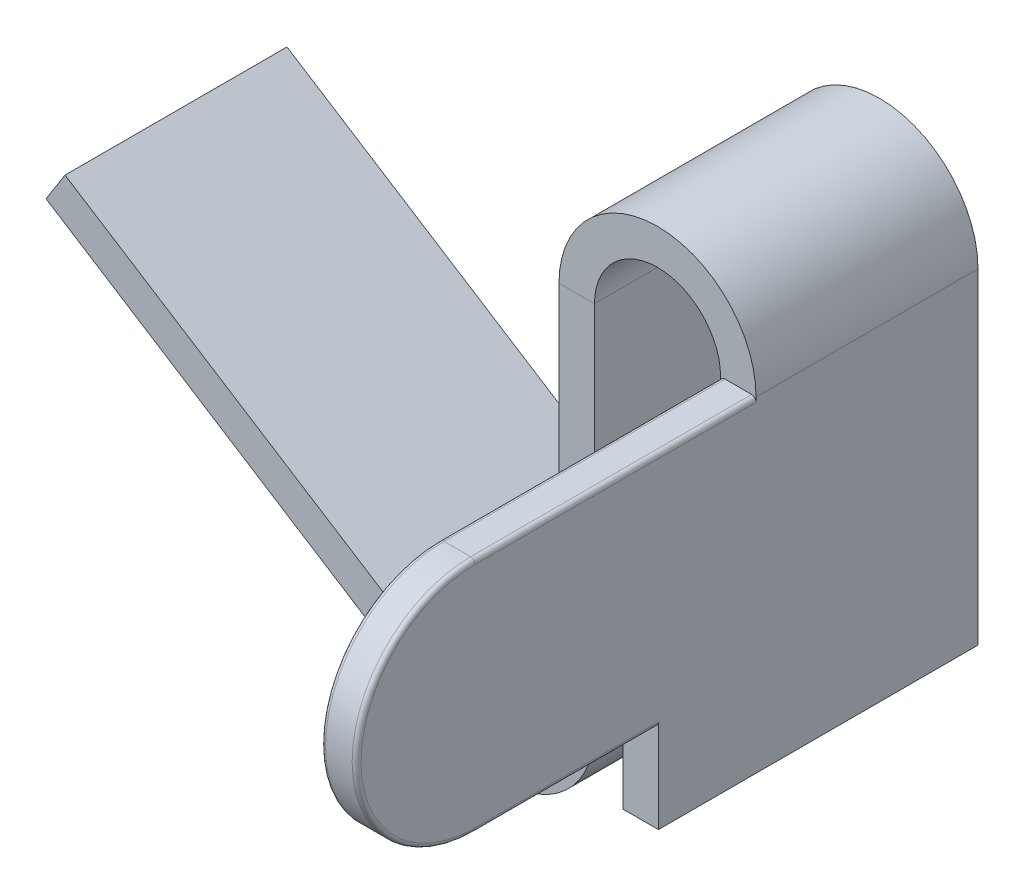
ISO-10303-21;
HEADER;
FILE_DESCRIPTION(('STEP AP214'),'2;1');
FILE_NAME('part.step','',(''),(''),'','','');
FILE_SCHEMA(('AUTOMOTIVE_DESIGN { 1 0 10303 214 1 1 1 1 }'));
ENDSEC;
DATA;
#1=APPLICATION_CONTEXT('core data for automotive mechanical design processes');
#2=APPLICATION_PROTOCOL_DEFINITION('international standard','automotive_design',2000,#1);
#3=PRODUCT_CONTEXT('',#1,'mechanical');
#4=PRODUCT('Part','Part','',(#3));
#5=PRODUCT_RELATED_PRODUCT_CATEGORY('part','',(#4));
#6=PRODUCT_DEFINITION_FORMATION('','',#4);
#7=PRODUCT_DEFINITION_CONTEXT('part definition',#1,'design');
#8=PRODUCT_DEFINITION('design','',#6,#7);
#9=PRODUCT_DEFINITION_SHAPE('','',#8);
#10=(LENGTH_UNIT() NAMED_UNIT(*) SI_UNIT(.MILLI.,.METRE.));
#11=(NAMED_UNIT(*) PLANE_ANGLE_UNIT() SI_UNIT($,.RADIAN.));
#12=(NAMED_UNIT(*) SI_UNIT($,.STERADIAN.) SOLID_ANGLE_UNIT());
#13=UNCERTAINTY_MEASURE_WITH_UNIT(LENGTH_MEASURE(1.E-05),#10,'distance_accuracy_value','');
#14=(GEOMETRIC_REPRESENTATION_CONTEXT(3) GLOBAL_UNCERTAINTY_ASSIGNED_CONTEXT((#13)) GLOBAL_UNIT_ASSIGNED_CONTEXT((#10,
#11,#12)) REPRESENTATION_CONTEXT('',''));
#15=CARTESIAN_POINT('',(0.,0.,0.));
#16=DIRECTION('',(0.,0.,1.));
#17=DIRECTION('',(1.,0.,0.));
#18=AXIS2_PLACEMENT_3D('',#15,#16,#17);
#19=CARTESIAN_POINT('',(0.71,0.5,5.665));
#20=DIRECTION('',(-1.,0.,0.));
#21=DIRECTION('',(0.,-1.,0.));
#22=AXIS2_PLACEMENT_3D('',#19,#20,#21);
#23=CYLINDRICAL_SURFACE('',#22,1.335);
#24=DIRECTION('',(1.,0.,0.));
#25=VECTOR('',#24,1.);
#26=CARTESIAN_POINT('',(0.71,-0.835,5.665));
#27=LINE('',#26,#25);
#28=CARTESIAN_POINT('',(1.06,-0.835,5.665));
#29=VERTEX_POINT('',#28);
#30=CARTESIAN_POINT('',(0.76,-0.835,5.665));
#31=VERTEX_POINT('',#30);
#32=EDGE_CURVE('E244',#29,#31,#27,.F.);
#33=ORIENTED_EDGE('',*,*,#32,.F.);
#34=CARTESIAN_POINT('',(1.06,0.5,5.665));
#35=DIRECTION('',(-1.,0.,0.));
#36=DIRECTION('',(0.,-1.,0.));
#37=AXIS2_PLACEMENT_3D('',#34,#35,#36);
#38=CIRCLE('',#37,1.335);
#39=CARTESIAN_POINT('',(1.06,1.835,5.665));
#40=VERTEX_POINT('',#39);
#41=EDGE_CURVE('E274',#29,#40,#38,.T.);
#42=ORIENTED_EDGE('',*,*,#41,.T.);
#43=DIRECTION('',(1.,0.,0.));
#44=VECTOR('',#43,1.);
#45=CARTESIAN_POINT('',(0.709999999999999,1.835,5.665));
#46=LINE('',#45,#44);
#47=CARTESIAN_POINT('',(0.76,1.835,5.665));
#48=VERTEX_POINT('',#47);
#49=EDGE_CURVE('E241',#48,#40,#46,.T.);
#50=ORIENTED_EDGE('',*,*,#49,.F.);
#51=CARTESIAN_POINT('',(0.76,0.5,5.665));
#52=DIRECTION('',(-1.,0.,0.));
#53=DIRECTION('',(0.,-1.,0.));
#54=AXIS2_PLACEMENT_3D('',#51,#52,#53);
#55=CIRCLE('',#54,1.335);
#56=EDGE_CURVE('E272',#48,#31,#55,.F.);
#57=ORIENTED_EDGE('',*,*,#56,.T.);
#58=EDGE_LOOP('',(#33,#42,#50,#57));
#59=FACE_BOUND('',#58,.T.);
#60=ADVANCED_FACE('F38',(#59),#23,.T.);
#61=CARTESIAN_POINT('',(-0.710000000000001,1.835,2.5));
#62=DIRECTION('',(0.,0.,1.));
#63=DIRECTION('',(1.,0.,0.));
#64=AXIS2_PLACEMENT_3D('',#61,#62,#63);
#65=PLANE('',#64);
#66=DIRECTION('',(-1.,0.,0.));
#67=VECTOR('',#66,1.);
#68=CARTESIAN_POINT('',(-0.710000000000001,1.835,2.5));
#69=LINE('',#68,#67);
#70=CARTESIAN_POINT('',(-0.710000000000001,1.835,2.5));
#71=VERTEX_POINT('',#70);
#72=CARTESIAN_POINT('',(-1.11,1.835,2.5));
#73=VERTEX_POINT('',#72);
#74=EDGE_CURVE('E239',#71,#73,#69,.T.);
#75=ORIENTED_EDGE('',*,*,#74,.F.);
#76=CARTESIAN_POINT('',(0.,1.835,2.5));
#77=DIRECTION('',(0.,0.,1.));
#78=DIRECTION('',(1.,0.,0.));
#79=AXIS2_PLACEMENT_3D('',#76,#77,#78);
#80=CIRCLE('',#79,0.710000000000001);
#81=CARTESIAN_POINT('',(0.71,1.835,2.5));
#82=VERTEX_POINT('',#81);
#83=EDGE_CURVE('E329',#82,#71,#80,.T.);
#84=ORIENTED_EDGE('',*,*,#83,.F.);
#85=DIRECTION('',(0.,1.,0.));
#86=VECTOR('',#85,1.);
#87=CARTESIAN_POINT('',(0.710000000000001,-1.835,2.5));
#88=LINE('',#87,#86);
#89=CARTESIAN_POINT('',(0.71,1.785,2.5));
#90=VERTEX_POINT('',#89);
#91=EDGE_CURVE('E270',#90,#82,#88,.T.);
#92=ORIENTED_EDGE('',*,*,#91,.F.);
#93=CARTESIAN_POINT('',(0.76,1.785,2.5));
#94=DIRECTION('',(0.,0.,1.));
#95=DIRECTION('',(1.,0.,0.));
#96=AXIS2_PLACEMENT_3D('',#93,#94,#95);
#97=CIRCLE('',#96,0.05);
#98=CARTESIAN_POINT('',(0.76,1.835,2.5));
#99=VERTEX_POINT('',#98);
#100=EDGE_CURVE('E11',#90,#99,#97,.F.);
#101=ORIENTED_EDGE('',*,*,#100,.T.);
#102=DIRECTION('',(-1.,0.,0.));
#103=VECTOR('',#102,1.);
#104=CARTESIAN_POINT('',(1.11,1.835,2.5));
#105=LINE('',#104,#103);
#106=CARTESIAN_POINT('',(1.06,1.835,2.5));
#107=VERTEX_POINT('',#106);
#108=EDGE_CURVE('E236',#107,#99,#105,.T.);
#109=ORIENTED_EDGE('',*,*,#108,.F.);
#110=CARTESIAN_POINT('',(1.06,1.785,2.5));
#111=DIRECTION('',(0.,0.,1.));
#112=DIRECTION('',(1.,0.,0.));
#113=AXIS2_PLACEMENT_3D('',#110,#111,#112);
#114=CIRCLE('',#113,0.05);
#115=CARTESIAN_POINT('',(1.11,1.785,2.5));
#116=VERTEX_POINT('',#115);
#117=EDGE_CURVE('E276',#107,#116,#114,.F.);
#118=ORIENTED_EDGE('',*,*,#117,.T.);
#119=DIRECTION('',(0.,-1.,0.));
#120=VECTOR('',#119,1.);
#121=CARTESIAN_POINT('',(1.11,1.835,2.5));
#122=LINE('',#121,#120);
#123=CARTESIAN_POINT('',(1.11,1.835,2.5));
#124=VERTEX_POINT('',#123);
#125=EDGE_CURVE('E55',#124,#116,#122,.T.);
#126=ORIENTED_EDGE('',*,*,#125,.F.);
#127=CARTESIAN_POINT('',(0.,1.835,2.5));
#128=DIRECTION('',(0.,0.,1.));
#129=DIRECTION('',(1.,0.,0.));
#130=AXIS2_PLACEMENT_3D('',#127,#128,#129);
#131=CIRCLE('',#130,1.11);
#132=EDGE_CURVE('E332',#124,#73,#131,.T.);
#133=ORIENTED_EDGE('',*,*,#132,.T.);
#134=EDGE_LOOP('',(#75,#84,#92,#101,#109,#118,#126,#133));
#135=FACE_BOUND('',#134,.T.);
#136=ADVANCED_FACE('F432',(#135),#65,.T.);
#137=CARTESIAN_POINT('',(1.11,1.835,2.5));
#138=DIRECTION('',(0.,0.,1.));
#139=DIRECTION('',(1.,0.,0.));
#140=AXIS2_PLACEMENT_3D('',#137,#138,#139);
#141=PLANE('',#140);
#142=DIRECTION('',(0.,-1.,0.));
#143=VECTOR('',#142,1.);
#144=CARTESIAN_POINT('',(-0.710000000000001,-1.835,2.5));
#145=LINE('',#144,#143);
#146=CARTESIAN_POINT('',(-0.71,-2.335,2.5));
#147=VERTEX_POINT('',#146);
#148=EDGE_CURVE('E326',#71,#147,#145,.T.);
#149=ORIENTED_EDGE('',*,*,#148,.F.);
#150=ORIENTED_EDGE('',*,*,#74,.T.);
#151=DIRECTION('',(0.,-1.,0.));
#152=VECTOR('',#151,1.);
#153=CARTESIAN_POINT('',(-1.11,1.835,2.5));
#154=LINE('',#153,#152);
#155=CARTESIAN_POINT('',(-1.11,-2.335,2.5));
#156=VERTEX_POINT('',#155);
#157=EDGE_CURVE('E334',#73,#156,#154,.T.);
#158=ORIENTED_EDGE('',*,*,#157,.T.);
#159=DIRECTION('',(1.,0.,0.));
#160=VECTOR('',#159,1.);
#161=CARTESIAN_POINT('',(-1.11,-2.335,2.5));
#162=LINE('',#161,#160);
#163=EDGE_CURVE('E228',#156,#147,#162,.T.);
#164=ORIENTED_EDGE('',*,*,#163,.T.);
#165=EDGE_LOOP('',(#149,#150,#158,#164));
#166=FACE_BOUND('',#165,.T.);
#167=ADVANCED_FACE('F430',(#166),#141,.T.);
#168=CARTESIAN_POINT('',(0.71,1.835,0.));
#169=DIRECTION('',(0.,0.,-1.));
#170=DIRECTION('',(-1.,0.,0.));
#171=AXIS2_PLACEMENT_3D('',#168,#169,#170);
#172=PLANE('',#171);
#173=DIRECTION('',(1.,0.,0.));
#174=VECTOR('',#173,1.);
#175=CARTESIAN_POINT('',(0.71,1.835,0.));
#176=LINE('',#175,#174);
#177=CARTESIAN_POINT('',(0.71,1.835,0.));
#178=VERTEX_POINT('',#177);
#179=CARTESIAN_POINT('',(1.11,1.835,0.));
#180=VERTEX_POINT('',#179);
#181=EDGE_CURVE('E234',#178,#180,#176,.T.);
#182=ORIENTED_EDGE('',*,*,#181,.F.);
#183=CARTESIAN_POINT('',(0.,1.835,0.));
#184=DIRECTION('',(0.,0.,1.));
#185=DIRECTION('',(1.,0.,0.));
#186=AXIS2_PLACEMENT_3D('',#183,#184,#185);
#187=CIRCLE('',#186,0.710000000000001);
#188=CARTESIAN_POINT('',(-0.710000000000001,1.835,0.));
#189=VERTEX_POINT('',#188);
#190=EDGE_CURVE('E355',#178,#189,#187,.T.);
#191=ORIENTED_EDGE('',*,*,#190,.T.);
#192=DIRECTION('',(1.,0.,0.));
#193=VECTOR('',#192,1.);
#194=CARTESIAN_POINT('',(-1.11,1.835,0.));
#195=LINE('',#194,#193);
#196=CARTESIAN_POINT('',(-1.11,1.835,0.));
#197=VERTEX_POINT('',#196);
#198=EDGE_CURVE('E232',#197,#189,#195,.T.);
#199=ORIENTED_EDGE('',*,*,#198,.F.);
#200=CARTESIAN_POINT('',(0.,1.835,0.));
#201=DIRECTION('',(0.,0.,1.));
#202=DIRECTION('',(1.,0.,0.));
#203=AXIS2_PLACEMENT_3D('',#200,#201,#202);
#204=CIRCLE('',#203,1.11);
#205=EDGE_CURVE('E364',#180,#197,#204,.T.);
#206=ORIENTED_EDGE('',*,*,#205,.F.);
#207=EDGE_LOOP('',(#182,#191,#199,#206));
#208=FACE_BOUND('',#207,.T.);
#209=ADVANCED_FACE('F388',(#208),#172,.T.);
#210=CARTESIAN_POINT('',(-1.11,1.835,0.));
#211=DIRECTION('',(0.,0.,-1.));
#212=DIRECTION('',(-1.,0.,0.));
#213=AXIS2_PLACEMENT_3D('',#210,#211,#212);
#214=PLANE('',#213);
#215=DIRECTION('',(0.,1.,0.));
#216=VECTOR('',#215,1.);
#217=CARTESIAN_POINT('',(0.710000000000001,-1.835,0.));
#218=LINE('',#217,#216);
#219=CARTESIAN_POINT('',(0.710000000000001,-1.835,0.));
#220=VERTEX_POINT('',#219);
#221=EDGE_CURVE('E358',#220,#178,#218,.T.);
#222=ORIENTED_EDGE('',*,*,#221,.T.);
#223=ORIENTED_EDGE('',*,*,#181,.T.);
#224=DIRECTION('',(0.,1.,0.));
#225=VECTOR('',#224,1.);
#226=CARTESIAN_POINT('',(1.11,-1.835,0.));
#227=LINE('',#226,#225);
#228=CARTESIAN_POINT('',(1.11,-1.835,0.));
#229=VERTEX_POINT('',#228);
#230=EDGE_CURVE('E362',#229,#180,#227,.T.);
#231=ORIENTED_EDGE('',*,*,#230,.F.);
#232=DIRECTION('',(-1.,0.,0.));
#233=VECTOR('',#232,1.);
#234=CARTESIAN_POINT('',(1.11,-1.835,0.));
#235=LINE('',#234,#233);
#236=EDGE_CURVE('E198',#229,#220,#235,.T.);
#237=ORIENTED_EDGE('',*,*,#236,.T.);
#238=EDGE_LOOP('',(#222,#223,#231,#237));
#239=FACE_BOUND('',#238,.T.);
#240=ADVANCED_FACE('F617',(#239),#214,.T.);
#241=CARTESIAN_POINT('',(-2.24626881057682,-3.1790472515224,2.5));
#242=DIRECTION('',(0.,0.,1.));
#243=DIRECTION('',(1.,0.,0.));
#244=AXIS2_PLACEMENT_3D('',#241,#242,#243);
#245=PLANE('',#244);
#246=DIRECTION('',(0.536268810576819,0.844047251522404,0.));
#247=VECTOR('',#246,1.);
#248=CARTESIAN_POINT('',(-2.24626881057682,-3.1790472515224,2.5));
#249=LINE('',#248,#247);
#250=CARTESIAN_POINT('',(-2.24626881057682,-3.1790472515224,2.5));
#251=VERTEX_POINT('',#250);
#252=CARTESIAN_POINT('',(-2.03176128634609,-2.84142835091344,2.5));
#253=VERTEX_POINT('',#252);
#254=EDGE_CURVE('E230',#251,#253,#249,.T.);
#255=ORIENTED_EDGE('',*,*,#254,.F.);
#256=CARTESIAN_POINT('',(-1.71,-2.335,2.5));
#257=DIRECTION('',(0.,0.,-1.));
#258=DIRECTION('',(-1.,0.,0.));
#259=AXIS2_PLACEMENT_3D('',#256,#257,#258);
#260=CIRCLE('',#259,1.);
#261=EDGE_CURVE('E323',#147,#251,#260,.T.);
#262=ORIENTED_EDGE('',*,*,#261,.F.);
#263=ORIENTED_EDGE('',*,*,#163,.F.);
#264=CARTESIAN_POINT('',(-1.71,-2.335,2.5));
#265=DIRECTION('',(0.,0.,1.));
#266=DIRECTION('',(1.,0.,0.));
#267=AXIS2_PLACEMENT_3D('',#264,#265,#266);
#268=CIRCLE('',#267,0.6);
#269=EDGE_CURVE('E337',#156,#253,#268,.F.);
#270=ORIENTED_EDGE('',*,*,#269,.T.);
#271=EDGE_LOOP('',(#255,#262,#263,#270));
#272=FACE_BOUND('',#271,.T.);
#273=ADVANCED_FACE('F424',(#272),#245,.T.);
#274=CARTESIAN_POINT('',(-1.11,-2.335,2.5));
#275=DIRECTION('',(0.,0.,1.));
#276=DIRECTION('',(1.,0.,0.));
#277=AXIS2_PLACEMENT_3D('',#274,#275,#276);
#278=PLANE('',#277);
#279=DIRECTION('',(-0.844047251522404,0.536268810576819,0.));
#280=VECTOR('',#279,1.);
#281=CARTESIAN_POINT('',(-2.24626881057682,-3.1790472515224,2.5));
#282=LINE('',#281,#280);
#283=CARTESIAN_POINT('',(-6.88852869395004,-0.229568793349898,2.5));
#284=VERTEX_POINT('',#283);
#285=EDGE_CURVE('E320',#251,#284,#282,.T.);
#286=ORIENTED_EDGE('',*,*,#285,.F.);
#287=ORIENTED_EDGE('',*,*,#254,.T.);
#288=DIRECTION('',(-0.844047251522404,0.536268810576819,0.));
#289=VECTOR('',#288,1.);
#290=CARTESIAN_POINT('',(-2.03176128634609,-2.84142835091344,2.5));
#291=LINE('',#290,#289);
#292=CARTESIAN_POINT('',(-6.67402116971931,0.108050107259063,2.5));
#293=VERTEX_POINT('',#292);
#294=EDGE_CURVE('E314',#253,#293,#291,.T.);
#295=ORIENTED_EDGE('',*,*,#294,.T.);
#296=DIRECTION('',(0.536268810576815,0.844047251522406,0.));
#297=VECTOR('',#296,1.);
#298=CARTESIAN_POINT('',(-6.88852869395004,-0.229568793349898,2.5));
#299=LINE('',#298,#297);
#300=EDGE_CURVE('E316',#284,#293,#299,.T.);
#301=ORIENTED_EDGE('',*,*,#300,.F.);
#302=EDGE_LOOP('',(#286,#287,#295,#301));
#303=FACE_BOUND('',#302,.T.);
#304=ADVANCED_FACE('F415',(#303),#278,.T.);
#305=CARTESIAN_POINT('',(-0.71,-2.335,0.));
#306=DIRECTION('',(0.,0.,-1.));
#307=DIRECTION('',(-1.,0.,0.));
#308=AXIS2_PLACEMENT_3D('',#305,#306,#307);
#309=PLANE('',#308);
#310=DIRECTION('',(-1.,0.,0.));
#311=VECTOR('',#310,1.);
#312=CARTESIAN_POINT('',(-0.71,-2.335,0.));
#313=LINE('',#312,#311);
#314=CARTESIAN_POINT('',(-0.71,-2.335,0.));
#315=VERTEX_POINT('',#314);
#316=CARTESIAN_POINT('',(-1.11,-2.335,0.));
#317=VERTEX_POINT('',#316);
#318=EDGE_CURVE('E226',#315,#317,#313,.T.);
#319=ORIENTED_EDGE('',*,*,#318,.F.);
#320=CARTESIAN_POINT('',(-1.71,-2.335,0.));
#321=DIRECTION('',(0.,0.,-1.));
#322=DIRECTION('',(-1.,0.,0.));
#323=AXIS2_PLACEMENT_3D('',#320,#321,#322);
#324=CIRCLE('',#323,1.);
#325=CARTESIAN_POINT('',(-2.24626881057682,-3.1790472515224,0.));
#326=VERTEX_POINT('',#325);
#327=EDGE_CURVE('E349',#315,#326,#324,.T.);
#328=ORIENTED_EDGE('',*,*,#327,.T.);
#329=DIRECTION('',(-0.536268810576819,-0.844047251522404,0.));
#330=VECTOR('',#329,1.);
#331=CARTESIAN_POINT('',(-2.03176128634609,-2.84142835091344,0.));
#332=LINE('',#331,#330);
#333=CARTESIAN_POINT('',(-2.03176128634609,-2.84142835091344,0.));
#334=VERTEX_POINT('',#333);
#335=EDGE_CURVE('E224',#334,#326,#332,.T.);
#336=ORIENTED_EDGE('',*,*,#335,.F.);
#337=CARTESIAN_POINT('',(-1.71,-2.335,0.));
#338=DIRECTION('',(0.,0.,1.));
#339=DIRECTION('',(1.,0.,0.));
#340=AXIS2_PLACEMENT_3D('',#337,#338,#339);
#341=CIRCLE('',#340,0.6);
#342=EDGE_CURVE('E317',#317,#334,#341,.F.);
#343=ORIENTED_EDGE('',*,*,#342,.F.);
#344=EDGE_LOOP('',(#319,#328,#336,#343));
#345=FACE_BOUND('',#344,.T.);
#346=ADVANCED_FACE('F395',(#345),#309,.T.);
#347=CARTESIAN_POINT('',(-2.03176128634609,-2.84142835091344,0.));
#348=DIRECTION('',(0.,0.,-1.));
#349=DIRECTION('',(-1.,0.,0.));
#350=AXIS2_PLACEMENT_3D('',#347,#348,#349);
#351=PLANE('',#350);
#352=DIRECTION('',(0.,-1.,0.));
#353=VECTOR('',#352,1.);
#354=CARTESIAN_POINT('',(-0.710000000000001,1.835,0.));
#355=LINE('',#354,#353);
#356=EDGE_CURVE('E352',#189,#315,#355,.T.);
#357=ORIENTED_EDGE('',*,*,#356,.T.);
#358=ORIENTED_EDGE('',*,*,#318,.T.);
#359=DIRECTION('',(0.,-1.,0.));
#360=VECTOR('',#359,1.);
#361=CARTESIAN_POINT('',(-1.11,-1.835,0.));
#362=LINE('',#361,#360);
#363=EDGE_CURVE('E367',#197,#317,#362,.T.);
#364=ORIENTED_EDGE('',*,*,#363,.F.);
#365=ORIENTED_EDGE('',*,*,#198,.T.);
#366=EDGE_LOOP('',(#357,#358,#364,#365));
#367=FACE_BOUND('',#366,.T.);
#368=ADVANCED_FACE('F391',(#367),#351,.T.);
#369=CARTESIAN_POINT('',(-2.03176128634609,-2.84142835091344,2.5));
#370=DIRECTION('',(-0.536268810576819,-0.844047251522404,0.));
#371=DIRECTION('',(0.844047251522404,-0.536268810576819,0.));
#372=AXIS2_PLACEMENT_3D('',#369,#370,#371);
#373=PLANE('',#372);
#374=DIRECTION('',(-0.844047251522404,0.536268810576819,0.));
#375=VECTOR('',#374,1.);
#376=CARTESIAN_POINT('',(-2.03176128634609,-2.84142835091344,0.));
#377=LINE('',#376,#375);
#378=CARTESIAN_POINT('',(-6.67402116971931,0.108050107259063,0.));
#379=VERTEX_POINT('',#378);
#380=EDGE_CURVE('E311',#334,#379,#377,.T.);
#381=ORIENTED_EDGE('',*,*,#380,.T.);
#382=DIRECTION('',(0.,0.,-1.));
#383=VECTOR('',#382,1.);
#384=CARTESIAN_POINT('',(-6.67402116971931,0.108050107259063,2.5));
#385=LINE('',#384,#383);
#386=EDGE_CURVE('E222',#293,#379,#385,.T.);
#387=ORIENTED_EDGE('',*,*,#386,.F.);
#388=ORIENTED_EDGE('',*,*,#294,.F.);
#389=DIRECTION('',(0.,0.,-1.));
#390=VECTOR('',#389,1.);
#391=CARTESIAN_POINT('',(-2.03176128634609,-2.84142835091344,2.5));
#392=LINE('',#391,#390);
#393=EDGE_CURVE('E340',#253,#334,#392,.T.);
#394=ORIENTED_EDGE('',*,*,#393,.T.);
#395=EDGE_LOOP('',(#381,#387,#388,#394));
#396=FACE_BOUND('',#395,.T.);
#397=ADVANCED_FACE('F404',(#396),#373,.F.);
#398=CARTESIAN_POINT('',(-6.88852869395004,-0.229568793349898,2.5));
#399=DIRECTION('',(-0.844047251522406,0.536268810576815,0.));
#400=DIRECTION('',(-0.536268810576815,-0.844047251522406,0.));
#401=AXIS2_PLACEMENT_3D('',#398,#399,#400);
#402=PLANE('',#401);
#403=DIRECTION('',(0.536268810576815,0.844047251522406,0.));
#404=VECTOR('',#403,1.);
#405=CARTESIAN_POINT('',(-6.88852869395004,-0.229568793349898,0.));
#406=LINE('',#405,#404);
#407=CARTESIAN_POINT('',(-6.88852869395004,-0.229568793349898,0.));
#408=VERTEX_POINT('',#407);
#409=EDGE_CURVE('E343',#408,#379,#406,.T.);
#410=ORIENTED_EDGE('',*,*,#409,.F.);
#411=DIRECTION('',(0.,0.,-1.));
#412=VECTOR('',#411,1.);
#413=CARTESIAN_POINT('',(-6.88852869395004,-0.229568793349898,2.5));
#414=LINE('',#413,#412);
#415=EDGE_CURVE('E220',#284,#408,#414,.T.);
#416=ORIENTED_EDGE('',*,*,#415,.F.);
#417=ORIENTED_EDGE('',*,*,#300,.T.);
#418=ORIENTED_EDGE('',*,*,#386,.T.);
#419=EDGE_LOOP('',(#410,#416,#417,#418));
#420=FACE_BOUND('',#419,.T.);
#421=ADVANCED_FACE('F411',(#420),#402,.T.);
#422=CARTESIAN_POINT('',(-2.24626881057682,-3.1790472515224,2.5));
#423=DIRECTION('',(-0.536268810576819,-0.844047251522404,0.));
#424=DIRECTION('',(0.844047251522404,-0.536268810576819,0.));
#425=AXIS2_PLACEMENT_3D('',#422,#423,#424);
#426=PLANE('',#425);
#427=DIRECTION('',(-0.844047251522404,0.536268810576819,0.));
#428=VECTOR('',#427,1.);
#429=CARTESIAN_POINT('',(-2.24626881057682,-3.1790472515224,0.));
#430=LINE('',#429,#428);
#431=EDGE_CURVE('E346',#326,#408,#430,.T.);
#432=ORIENTED_EDGE('',*,*,#431,.F.);
#433=DIRECTION('',(0.,0.,-1.));
#434=VECTOR('',#433,1.);
#435=CARTESIAN_POINT('',(-2.24626881057682,-3.1790472515224,2.5));
#436=LINE('',#435,#434);
#437=EDGE_CURVE('E217',#251,#326,#436,.T.);
#438=ORIENTED_EDGE('',*,*,#437,.F.);
#439=ORIENTED_EDGE('',*,*,#285,.T.);
#440=ORIENTED_EDGE('',*,*,#415,.T.);
#441=EDGE_LOOP('',(#432,#438,#439,#440));
#442=FACE_BOUND('',#441,.T.);
#443=ADVANCED_FACE('F418',(#442),#426,.T.);
#444=CARTESIAN_POINT('',(-1.71,-2.335,2.5));
#445=DIRECTION('',(0.,0.,-1.));
#446=DIRECTION('',(-1.,0.,0.));
#447=AXIS2_PLACEMENT_3D('',#444,#445,#446);
#448=CYLINDRICAL_SURFACE('',#447,1.);
#449=ORIENTED_EDGE('',*,*,#327,.F.);
#450=DIRECTION('',(0.,0.,-1.));
#451=VECTOR('',#450,1.);
#452=CARTESIAN_POINT('',(-0.71,-2.335,2.5));
#453=LINE('',#452,#451);
#454=EDGE_CURVE('E214',#147,#315,#453,.T.);
#455=ORIENTED_EDGE('',*,*,#454,.F.);
#456=ORIENTED_EDGE('',*,*,#261,.T.);
#457=ORIENTED_EDGE('',*,*,#437,.T.);
#458=EDGE_LOOP('',(#449,#455,#456,#457));
#459=FACE_BOUND('',#458,.T.);
#460=ADVANCED_FACE('F420',(#459),#448,.T.);
#461=CARTESIAN_POINT('',(-0.710000000000001,1.835,2.5));
#462=DIRECTION('',(1.,0.,0.));
#463=DIRECTION('',(0.,1.,0.));
#464=AXIS2_PLACEMENT_3D('',#461,#462,#463);
#465=PLANE('',#464);
#466=ORIENTED_EDGE('',*,*,#356,.F.);
#467=DIRECTION('',(0.,0.,-1.));
#468=VECTOR('',#467,1.);
#469=CARTESIAN_POINT('',(-0.710000000000001,1.835,2.5));
#470=LINE('',#469,#468);
#471=EDGE_CURVE('E211',#71,#189,#470,.T.);
#472=ORIENTED_EDGE('',*,*,#471,.F.);
#473=ORIENTED_EDGE('',*,*,#148,.T.);
#474=ORIENTED_EDGE('',*,*,#454,.T.);
#475=EDGE_LOOP('',(#466,#472,#473,#474));
#476=FACE_BOUND('',#475,.T.);
#477=ADVANCED_FACE('F428',(#476),#465,.T.);
#478=CARTESIAN_POINT('',(0.,1.835,2.5));
#479=DIRECTION('',(0.,0.,-1.));
#480=DIRECTION('',(-1.,0.,0.));
#481=AXIS2_PLACEMENT_3D('',#478,#479,#480);
#482=CYLINDRICAL_SURFACE('',#481,0.710000000000001);
#483=ORIENTED_EDGE('',*,*,#190,.F.);
#484=DIRECTION('',(0.,0.,-1.));
#485=VECTOR('',#484,1.);
#486=CARTESIAN_POINT('',(0.71,1.835,2.5));
#487=LINE('',#486,#485);
#488=EDGE_CURVE('E202',#82,#178,#487,.T.);
#489=ORIENTED_EDGE('',*,*,#488,.F.);
#490=ORIENTED_EDGE('',*,*,#83,.T.);
#491=ORIENTED_EDGE('',*,*,#471,.T.);
#492=EDGE_LOOP('',(#483,#489,#490,#491));
#493=FACE_BOUND('',#492,.T.);
#494=ADVANCED_FACE('F555',(#493),#482,.F.);
#495=CARTESIAN_POINT('',(0.710000000000001,-1.835,2.5));
#496=DIRECTION('',(-1.,0.,0.));
#497=DIRECTION('',(0.,-1.,0.));
#498=AXIS2_PLACEMENT_3D('',#495,#496,#497);
#499=PLANE('',#498);
#500=DIRECTION('',(0.,0.,-1.));
#501=VECTOR('',#500,1.);
#502=CARTESIAN_POINT('',(0.71,1.785,2.5));
#503=LINE('',#502,#501);
#504=CARTESIAN_POINT('',(0.71,1.785,5.665));
#505=VERTEX_POINT('',#504);
#506=EDGE_CURVE('E265',#505,#90,#503,.T.);
#507=ORIENTED_EDGE('',*,*,#506,.T.);
#508=ORIENTED_EDGE('',*,*,#91,.T.);
#509=ORIENTED_EDGE('',*,*,#488,.T.);
#510=ORIENTED_EDGE('',*,*,#221,.F.);
#511=DIRECTION('',(0.,0.,-1.));
#512=VECTOR('',#511,1.);
#513=CARTESIAN_POINT('',(0.710000000000001,-1.835,2.5));
#514=LINE('',#513,#512);
#515=CARTESIAN_POINT('',(0.710000000000001,-1.835,3.6));
#516=VERTEX_POINT('',#515);
#517=EDGE_CURVE('E199',#516,#220,#514,.T.);
#518=ORIENTED_EDGE('',*,*,#517,.F.);
#519=DIRECTION('',(0.,-1.,0.));
#520=VECTOR('',#519,1.);
#521=CARTESIAN_POINT('',(0.710000000000001,-1.835,3.6));
#522=LINE('',#521,#520);
#523=CARTESIAN_POINT('',(0.71,-0.785,3.6));
#524=VERTEX_POINT('',#523);
#525=EDGE_CURVE('E63',#524,#516,#522,.T.);
#526=ORIENTED_EDGE('',*,*,#525,.F.);
#527=DIRECTION('',(0.,0.,-1.));
#528=VECTOR('',#527,1.);
#529=CARTESIAN_POINT('',(0.71,-0.785,5.665));
#530=LINE('',#529,#528);
#531=CARTESIAN_POINT('',(0.71,-0.785,5.665));
#532=VERTEX_POINT('',#531);
#533=EDGE_CURVE('E268',#524,#532,#530,.F.);
#534=ORIENTED_EDGE('',*,*,#533,.T.);
#535=CARTESIAN_POINT('',(0.71,0.5,5.665));
#536=DIRECTION('',(-1.,0.,0.));
#537=DIRECTION('',(0.,-1.,0.));
#538=AXIS2_PLACEMENT_3D('',#535,#536,#537);
#539=CIRCLE('',#538,1.285);
#540=EDGE_CURVE('E263',#532,#505,#539,.T.);
#541=ORIENTED_EDGE('',*,*,#540,.T.);
#542=EDGE_LOOP('',(#507,#508,#509,#510,#518,#526,#534,#541));
#543=FACE_BOUND('',#542,.T.);
#544=ADVANCED_FACE('F301',(#543),#499,.T.);
#545=CARTESIAN_POINT('',(1.11,-1.835,2.5));
#546=DIRECTION('',(0.,-1.,0.));
#547=DIRECTION('',(0.,0.,-1.));
#548=AXIS2_PLACEMENT_3D('',#545,#546,#547);
#549=PLANE('',#548);
#550=DIRECTION('',(1.,0.,0.));
#551=VECTOR('',#550,1.);
#552=CARTESIAN_POINT('',(-3.39,-1.835,3.6));
#553=LINE('',#552,#551);
#554=CARTESIAN_POINT('',(1.11,-1.835,3.6));
#555=VERTEX_POINT('',#554);
#556=EDGE_CURVE('E176',#516,#555,#553,.T.);
#557=ORIENTED_EDGE('',*,*,#556,.F.);
#558=ORIENTED_EDGE('',*,*,#517,.T.);
#559=ORIENTED_EDGE('',*,*,#236,.F.);
#560=DIRECTION('',(0.,0.,-1.));
#561=VECTOR('',#560,1.);
#562=CARTESIAN_POINT('',(1.11,-1.835,2.5));
#563=LINE('',#562,#561);
#564=EDGE_CURVE('E188',#555,#229,#563,.T.);
#565=ORIENTED_EDGE('',*,*,#564,.F.);
#566=EDGE_LOOP('',(#557,#558,#559,#565));
#567=FACE_BOUND('',#566,.T.);
#568=ADVANCED_FACE('F196',(#567),#549,.T.);
#569=CARTESIAN_POINT('',(1.11,-1.835,2.5));
#570=DIRECTION('',(-1.,0.,0.));
#571=DIRECTION('',(0.,-1.,0.));
#572=AXIS2_PLACEMENT_3D('',#569,#570,#571);
#573=PLANE('',#572);
#574=DIRECTION('',(0.,0.,1.));
#575=VECTOR('',#574,1.);
#576=CARTESIAN_POINT('',(1.11,-0.785,2.5));
#577=LINE('',#576,#575);
#578=CARTESIAN_POINT('',(1.11,-0.785,5.665));
#579=VERTEX_POINT('',#578);
#580=CARTESIAN_POINT('',(1.11,-0.785,3.6));
#581=VERTEX_POINT('',#580);
#582=EDGE_CURVE('E191',#579,#581,#577,.F.);
#583=ORIENTED_EDGE('',*,*,#582,.T.);
#584=DIRECTION('',(0.,1.,0.));
#585=VECTOR('',#584,1.);
#586=CARTESIAN_POINT('',(1.11,-1.835,3.6));
#587=LINE('',#586,#585);
#588=EDGE_CURVE('E179',#555,#581,#587,.T.);
#589=ORIENTED_EDGE('',*,*,#588,.F.);
#590=ORIENTED_EDGE('',*,*,#564,.T.);
#591=ORIENTED_EDGE('',*,*,#230,.T.);
#592=DIRECTION('',(0.,0.,-1.));
#593=VECTOR('',#592,1.);
#594=CARTESIAN_POINT('',(1.11,1.835,2.5));
#595=LINE('',#594,#593);
#596=EDGE_CURVE('E200',#124,#180,#595,.T.);
#597=ORIENTED_EDGE('',*,*,#596,.F.);
#598=ORIENTED_EDGE('',*,*,#125,.T.);
#599=DIRECTION('',(0.,0.,-1.));
#600=VECTOR('',#599,1.);
#601=CARTESIAN_POINT('',(1.11,1.785,2.5));
#602=LINE('',#601,#600);
#603=CARTESIAN_POINT('',(1.11,1.785,5.665));
#604=VERTEX_POINT('',#603);
#605=EDGE_CURVE('E255',#116,#604,#602,.F.);
#606=ORIENTED_EDGE('',*,*,#605,.T.);
#607=CARTESIAN_POINT('',(1.11,0.5,5.665));
#608=DIRECTION('',(-1.,0.,0.));
#609=DIRECTION('',(0.,-1.,0.));
#610=AXIS2_PLACEMENT_3D('',#607,#608,#609);
#611=CIRCLE('',#610,1.285);
#612=EDGE_CURVE('E252',#604,#579,#611,.F.);
#613=ORIENTED_EDGE('',*,*,#612,.T.);
#614=EDGE_LOOP('',(#583,#589,#590,#591,#597,#598,#606,#613));
#615=FACE_BOUND('',#614,.T.);
#616=ADVANCED_FACE('F186',(#615),#573,.F.);
#617=CARTESIAN_POINT('',(0.,1.835,2.5));
#618=DIRECTION('',(0.,0.,-1.));
#619=DIRECTION('',(-1.,0.,0.));
#620=AXIS2_PLACEMENT_3D('',#617,#618,#619);
#621=CYLINDRICAL_SURFACE('',#620,1.11);
#622=ORIENTED_EDGE('',*,*,#205,.T.);
#623=DIRECTION('',(0.,0.,-1.));
#624=VECTOR('',#623,1.);
#625=CARTESIAN_POINT('',(-1.11,1.835,2.5));
#626=LINE('',#625,#624);
#627=EDGE_CURVE('E205',#73,#197,#626,.T.);
#628=ORIENTED_EDGE('',*,*,#627,.F.);
#629=ORIENTED_EDGE('',*,*,#132,.F.);
#630=ORIENTED_EDGE('',*,*,#596,.T.);
#631=EDGE_LOOP('',(#622,#628,#629,#630));
#632=FACE_BOUND('',#631,.T.);
#633=ADVANCED_FACE('F385',(#632),#621,.T.);
#634=CARTESIAN_POINT('',(-1.11,-1.835,2.5));
#635=DIRECTION('',(1.,0.,0.));
#636=DIRECTION('',(0.,1.,0.));
#637=AXIS2_PLACEMENT_3D('',#634,#635,#636);
#638=PLANE('',#637);
#639=ORIENTED_EDGE('',*,*,#363,.T.);
#640=DIRECTION('',(0.,0.,-1.));
#641=VECTOR('',#640,1.);
#642=CARTESIAN_POINT('',(-1.11,-2.335,2.5));
#643=LINE('',#642,#641);
#644=EDGE_CURVE('E374',#156,#317,#643,.T.);
#645=ORIENTED_EDGE('',*,*,#644,.F.);
#646=ORIENTED_EDGE('',*,*,#157,.F.);
#647=ORIENTED_EDGE('',*,*,#627,.T.);
#648=EDGE_LOOP('',(#639,#645,#646,#647));
#649=FACE_BOUND('',#648,.T.);
#650=ADVANCED_FACE('F380',(#649),#638,.F.);
#651=CARTESIAN_POINT('',(-1.71,-2.335,2.5));
#652=DIRECTION('',(0.,0.,-1.));
#653=DIRECTION('',(-1.,0.,0.));
#654=AXIS2_PLACEMENT_3D('',#651,#652,#653);
#655=CYLINDRICAL_SURFACE('',#654,0.6);
#656=ORIENTED_EDGE('',*,*,#342,.T.);
#657=ORIENTED_EDGE('',*,*,#393,.F.);
#658=ORIENTED_EDGE('',*,*,#269,.F.);
#659=ORIENTED_EDGE('',*,*,#644,.T.);
#660=EDGE_LOOP('',(#656,#657,#658,#659));
#661=FACE_BOUND('',#660,.T.);
#662=ADVANCED_FACE('F399',(#661),#655,.F.);
#663=CARTESIAN_POINT('',(-1.71,-2.335,0.));
#664=DIRECTION('',(0.,0.,-1.));
#665=DIRECTION('',(-1.,0.,0.));
#666=AXIS2_PLACEMENT_3D('',#663,#664,#665);
#667=PLANE('',#666);
#668=ORIENTED_EDGE('',*,*,#380,.F.);
#669=ORIENTED_EDGE('',*,*,#335,.T.);
#670=ORIENTED_EDGE('',*,*,#431,.T.);
#671=ORIENTED_EDGE('',*,*,#409,.T.);
#672=EDGE_LOOP('',(#668,#669,#670,#671));
#673=FACE_BOUND('',#672,.T.);
#674=ADVANCED_FACE('F407',(#673),#667,.T.);
#675=CARTESIAN_POINT('',(1.11,1.835,7.));
#676=DIRECTION('',(0.,-1.,0.));
#677=DIRECTION('',(1.,0.,0.));
#678=AXIS2_PLACEMENT_3D('',#675,#676,#677);
#679=PLANE('',#678);
#680=ORIENTED_EDGE('',*,*,#49,.T.);
#681=DIRECTION('',(0.,0.,-1.));
#682=VECTOR('',#681,1.);
#683=CARTESIAN_POINT('',(1.06,1.835,7.));
#684=LINE('',#683,#682);
#685=EDGE_CURVE('E249',#40,#107,#684,.T.);
#686=ORIENTED_EDGE('',*,*,#685,.T.);
#687=ORIENTED_EDGE('',*,*,#108,.T.);
#688=DIRECTION('',(0.,0.,-1.));
#689=VECTOR('',#688,1.);
#690=CARTESIAN_POINT('',(0.76,1.835,5.665));
#691=LINE('',#690,#689);
#692=EDGE_CURVE('E247',#99,#48,#691,.F.);
#693=ORIENTED_EDGE('',*,*,#692,.T.);
#694=EDGE_LOOP('',(#680,#686,#687,#693));
#695=FACE_BOUND('',#694,.T.);
#696=ADVANCED_FACE('F496',(#695),#679,.F.);
#697=CARTESIAN_POINT('',(-3.39,-0.835000000000001,7.));
#698=DIRECTION('',(0.,1.,0.));
#699=DIRECTION('',(-1.,0.,0.));
#700=AXIS2_PLACEMENT_3D('',#697,#698,#699);
#701=PLANE('',#700);
#702=DIRECTION('',(1.,0.,0.));
#703=VECTOR('',#702,1.);
#704=CARTESIAN_POINT('',(-3.39,-0.835000000000001,3.6));
#705=LINE('',#704,#703);
#706=CARTESIAN_POINT('',(0.76,-0.835,3.6));
#707=VERTEX_POINT('',#706);
#708=CARTESIAN_POINT('',(1.06,-0.835,3.6));
#709=VERTEX_POINT('',#708);
#710=EDGE_CURVE('E183',#707,#709,#705,.T.);
#711=ORIENTED_EDGE('',*,*,#710,.T.);
#712=DIRECTION('',(0.,0.,1.));
#713=VECTOR('',#712,1.);
#714=CARTESIAN_POINT('',(1.06,-0.835,7.));
#715=LINE('',#714,#713);
#716=EDGE_CURVE('E261',#709,#29,#715,.T.);
#717=ORIENTED_EDGE('',*,*,#716,.T.);
#718=ORIENTED_EDGE('',*,*,#32,.T.);
#719=DIRECTION('',(0.,0.,-1.));
#720=VECTOR('',#719,1.);
#721=CARTESIAN_POINT('',(0.76,-0.835,3.6));
#722=LINE('',#721,#720);
#723=EDGE_CURVE('E258',#31,#707,#722,.T.);
#724=ORIENTED_EDGE('',*,*,#723,.T.);
#725=EDGE_LOOP('',(#711,#717,#718,#724));
#726=FACE_BOUND('',#725,.T.);
#727=ADVANCED_FACE('F307',(#726),#701,.F.);
#728=CARTESIAN_POINT('',(-3.39,-1.835,3.6));
#729=DIRECTION('',(0.,0.,-1.));
#730=DIRECTION('',(-1.,0.,0.));
#731=AXIS2_PLACEMENT_3D('',#728,#729,#730);
#732=PLANE('',#731);
#733=ORIENTED_EDGE('',*,*,#525,.T.);
#734=ORIENTED_EDGE('',*,*,#556,.T.);
#735=ORIENTED_EDGE('',*,*,#588,.T.);
#736=CARTESIAN_POINT('',(1.06,-0.785,3.6));
#737=DIRECTION('',(0.,0.,-1.));
#738=DIRECTION('',(-1.,0.,0.));
#739=AXIS2_PLACEMENT_3D('',#736,#737,#738);
#740=CIRCLE('',#739,0.05);
#741=EDGE_CURVE('E278',#581,#709,#740,.T.);
#742=ORIENTED_EDGE('',*,*,#741,.T.);
#743=ORIENTED_EDGE('',*,*,#710,.F.);
#744=CARTESIAN_POINT('',(0.76,-0.785,3.6));
#745=DIRECTION('',(0.,0.,-1.));
#746=DIRECTION('',(-1.,0.,0.));
#747=AXIS2_PLACEMENT_3D('',#744,#745,#746);
#748=CIRCLE('',#747,0.05);
#749=EDGE_CURVE('E47',#707,#524,#748,.T.);
#750=ORIENTED_EDGE('',*,*,#749,.T.);
#751=EDGE_LOOP('',(#733,#734,#735,#742,#743,#750));
#752=FACE_BOUND('',#751,.T.);
#753=ADVANCED_FACE('F178',(#752),#732,.F.);
#754=CARTESIAN_POINT('',(1.06,-0.785,7.));
#755=DIRECTION('',(0.,0.,1.));
#756=DIRECTION('',(0.,-1.,0.));
#757=AXIS2_PLACEMENT_3D('',#754,#755,#756);
#758=CYLINDRICAL_SURFACE('',#757,0.05);
#759=ORIENTED_EDGE('',*,*,#741,.F.);
#760=ORIENTED_EDGE('',*,*,#582,.F.);
#761=CARTESIAN_POINT('',(1.06,-0.785,5.665));
#762=DIRECTION('',(0.,0.,1.));
#763=DIRECTION('',(1.,0.,0.));
#764=AXIS2_PLACEMENT_3D('',#761,#762,#763);
#765=CIRCLE('',#764,0.05);
#766=EDGE_CURVE('E193',#29,#579,#765,.T.);
#767=ORIENTED_EDGE('',*,*,#766,.F.);
#768=ORIENTED_EDGE('',*,*,#716,.F.);
#769=EDGE_LOOP('',(#759,#760,#767,#768));
#770=FACE_BOUND('',#769,.T.);
#771=ADVANCED_FACE('F455',(#770),#758,.T.);
#772=CARTESIAN_POINT('',(1.06,0.5,5.665));
#773=DIRECTION('',(-1.,0.,0.));
#774=DIRECTION('',(0.,-1.,0.));
#775=AXIS2_PLACEMENT_3D('',#772,#773,#774);
#776=TOROIDAL_SURFACE('',#775,1.285,0.05);
#777=ORIENTED_EDGE('',*,*,#766,.T.);
#778=ORIENTED_EDGE('',*,*,#612,.F.);
#779=CARTESIAN_POINT('',(1.06,1.785,5.665));
#780=DIRECTION('',(0.,0.,-1.));
#781=DIRECTION('',(-1.,0.,0.));
#782=AXIS2_PLACEMENT_3D('',#779,#780,#781);
#783=CIRCLE('',#782,0.05);
#784=EDGE_CURVE('E281',#40,#604,#783,.T.);
#785=ORIENTED_EDGE('',*,*,#784,.F.);
#786=ORIENTED_EDGE('',*,*,#41,.F.);
#787=EDGE_LOOP('',(#777,#778,#785,#786));
#788=FACE_BOUND('',#787,.T.);
#789=ADVANCED_FACE('F451',(#788),#776,.T.);
#790=CARTESIAN_POINT('',(1.06,1.785,7.));
#791=DIRECTION('',(0.,0.,-1.));
#792=DIRECTION('',(-1.,0.,0.));
#793=AXIS2_PLACEMENT_3D('',#790,#791,#792);
#794=CYLINDRICAL_SURFACE('',#793,0.05);
#795=ORIENTED_EDGE('',*,*,#784,.T.);
#796=ORIENTED_EDGE('',*,*,#605,.F.);
#797=ORIENTED_EDGE('',*,*,#117,.F.);
#798=ORIENTED_EDGE('',*,*,#685,.F.);
#799=EDGE_LOOP('',(#795,#796,#797,#798));
#800=FACE_BOUND('',#799,.T.);
#801=ADVANCED_FACE('F448',(#800),#794,.T.);
#802=CARTESIAN_POINT('',(0.76,1.785,2.5));
#803=DIRECTION('',(0.,0.,1.));
#804=DIRECTION('',(1.,0.,0.));
#805=AXIS2_PLACEMENT_3D('',#802,#803,#804);
#806=CYLINDRICAL_SURFACE('',#805,0.05);
#807=ORIENTED_EDGE('',*,*,#100,.F.);
#808=ORIENTED_EDGE('',*,*,#506,.F.);
#809=CARTESIAN_POINT('',(0.76,1.785,5.665));
#810=DIRECTION('',(0.,0.,1.));
#811=DIRECTION('',(1.,0.,0.));
#812=AXIS2_PLACEMENT_3D('',#809,#810,#811);
#813=CIRCLE('',#812,0.05);
#814=EDGE_CURVE('E42',#48,#505,#813,.T.);
#815=ORIENTED_EDGE('',*,*,#814,.F.);
#816=ORIENTED_EDGE('',*,*,#692,.F.);
#817=EDGE_LOOP('',(#807,#808,#815,#816));
#818=FACE_BOUND('',#817,.T.);
#819=ADVANCED_FACE('F40',(#818),#806,.T.);
#820=CARTESIAN_POINT('',(0.76,0.5,5.665));
#821=DIRECTION('',(-1.,0.,0.));
#822=DIRECTION('',(0.,-1.,0.));
#823=AXIS2_PLACEMENT_3D('',#820,#821,#822);
#824=TOROIDAL_SURFACE('',#823,1.285,0.05);
#825=ORIENTED_EDGE('',*,*,#814,.T.);
#826=ORIENTED_EDGE('',*,*,#540,.F.);
#827=CARTESIAN_POINT('',(0.76,-0.785,5.665));
#828=DIRECTION('',(0.,0.,-1.));
#829=DIRECTION('',(-1.,0.,0.));
#830=AXIS2_PLACEMENT_3D('',#827,#828,#829);
#831=CIRCLE('',#830,0.05);
#832=EDGE_CURVE('E285',#31,#532,#831,.T.);
#833=ORIENTED_EDGE('',*,*,#832,.F.);
#834=ORIENTED_EDGE('',*,*,#56,.F.);
#835=EDGE_LOOP('',(#825,#826,#833,#834));
#836=FACE_BOUND('',#835,.T.);
#837=ADVANCED_FACE('F296',(#836),#824,.T.);
#838=CARTESIAN_POINT('',(0.76,-0.785,7.));
#839=DIRECTION('',(0.,0.,1.));
#840=DIRECTION('',(0.,-1.,0.));
#841=AXIS2_PLACEMENT_3D('',#838,#839,#840);
#842=CYLINDRICAL_SURFACE('',#841,0.05);
#843=ORIENTED_EDGE('',*,*,#832,.T.);
#844=ORIENTED_EDGE('',*,*,#533,.F.);
#845=ORIENTED_EDGE('',*,*,#749,.F.);
#846=ORIENTED_EDGE('',*,*,#723,.F.);
#847=EDGE_LOOP('',(#843,#844,#845,#846));
#848=FACE_BOUND('',#847,.T.);
#849=ADVANCED_FACE('F303',(#848),#842,.T.);
#850=CLOSED_SHELL('',(#60,#136,#167,#209,#240,#273,#304,#346,#368,#397,#421,#443,#460,#477,#494,
#544,#568,#616,#633,#650,#662,#674,#696,#727,#753,#771,#789,#801,#819,#837,#849));
#851=MANIFOLD_SOLID_BREP('B2',#850);
#852=ADVANCED_BREP_SHAPE_REPRESENTATION('',(#18,#851),#14);
#853=SHAPE_DEFINITION_REPRESENTATION(#9,#852);
ENDSEC;
END-ISO-10303-21;
